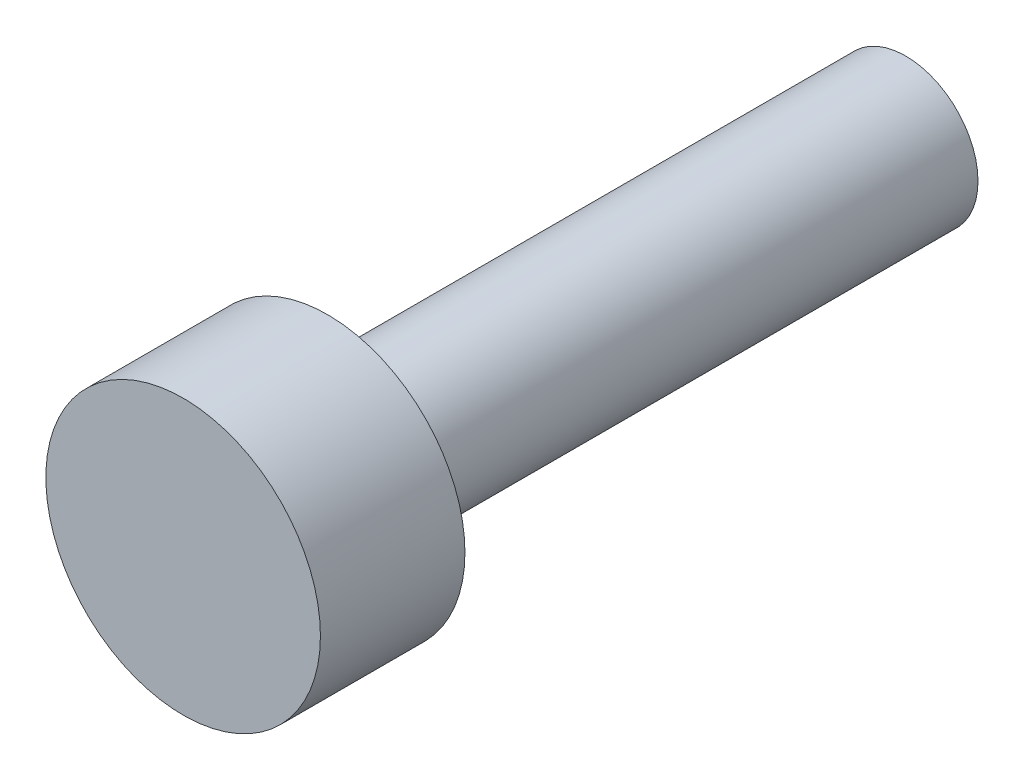
ISO-10303-21;
HEADER;
FILE_DESCRIPTION(('STEP AP214'),'2;1');
FILE_NAME('part.step','',(''),(''),'','','');
FILE_SCHEMA(('AUTOMOTIVE_DESIGN { 1 0 10303 214 1 1 1 1 }'));
ENDSEC;
DATA;
#1=APPLICATION_CONTEXT('core data for automotive mechanical design processes');
#2=APPLICATION_PROTOCOL_DEFINITION('international standard','automotive_design',2000,#1);
#3=PRODUCT_CONTEXT('',#1,'mechanical');
#4=PRODUCT('Part','Part','',(#3));
#5=PRODUCT_RELATED_PRODUCT_CATEGORY('part','',(#4));
#6=PRODUCT_DEFINITION_FORMATION('','',#4);
#7=PRODUCT_DEFINITION_CONTEXT('part definition',#1,'design');
#8=PRODUCT_DEFINITION('design','',#6,#7);
#9=PRODUCT_DEFINITION_SHAPE('','',#8);
#10=(LENGTH_UNIT() NAMED_UNIT(*) SI_UNIT(.MILLI.,.METRE.));
#11=(NAMED_UNIT(*) PLANE_ANGLE_UNIT() SI_UNIT($,.RADIAN.));
#12=(NAMED_UNIT(*) SI_UNIT($,.STERADIAN.) SOLID_ANGLE_UNIT());
#13=UNCERTAINTY_MEASURE_WITH_UNIT(LENGTH_MEASURE(1.E-05),#10,'distance_accuracy_value','');
#14=(GEOMETRIC_REPRESENTATION_CONTEXT(3) GLOBAL_UNCERTAINTY_ASSIGNED_CONTEXT((#13)) GLOBAL_UNIT_ASSIGNED_CONTEXT((#10,
#11,#12)) REPRESENTATION_CONTEXT('',''));
#15=CARTESIAN_POINT('',(0.,0.,0.));
#16=DIRECTION('',(0.,0.,1.));
#17=DIRECTION('',(1.,0.,0.));
#18=AXIS2_PLACEMENT_3D('',#15,#16,#17);
#19=CARTESIAN_POINT('',(0.,0.,0.));
#20=DIRECTION('',(0.,0.,-1.));
#21=DIRECTION('',(-1.,0.,0.));
#22=AXIS2_PLACEMENT_3D('',#19,#20,#21);
#23=CYLINDRICAL_SURFACE('',#22,1.);
#24=CARTESIAN_POINT('',(0.,0.,0.));
#25=DIRECTION('',(0.,0.,1.));
#26=DIRECTION('',(1.,0.,0.));
#27=AXIS2_PLACEMENT_3D('',#24,#25,#26);
#28=CIRCLE('',#27,1.);
#29=CARTESIAN_POINT('',(1.,0.,0.));
#30=VERTEX_POINT('',#29);
#31=EDGE_CURVE('E10',#30,#30,#28,.T.);
#32=ORIENTED_EDGE('',*,*,#31,.F.);
#33=EDGE_LOOP('',(#32));
#34=FACE_BOUND('',#33,.T.);
#35=CARTESIAN_POINT('',(0.,0.,-8.));
#36=DIRECTION('',(0.,0.,1.));
#37=DIRECTION('',(1.,0.,0.));
#38=AXIS2_PLACEMENT_3D('',#35,#36,#37);
#39=CIRCLE('',#38,1.);
#40=CARTESIAN_POINT('',(1.,0.,-8.));
#41=VERTEX_POINT('',#40);
#42=EDGE_CURVE('E37',#41,#41,#39,.T.);
#43=ORIENTED_EDGE('',*,*,#42,.T.);
#44=EDGE_LOOP('',(#43));
#45=FACE_BOUND('',#44,.T.);
#46=ADVANCED_FACE('F40',(#34,#45),#23,.T.);
#47=CARTESIAN_POINT('',(0.,0.,-8.));
#48=DIRECTION('',(0.,0.,1.));
#49=DIRECTION('',(1.,0.,0.));
#50=AXIS2_PLACEMENT_3D('',#47,#48,#49);
#51=PLANE('',#50);
#52=ORIENTED_EDGE('',*,*,#42,.F.);
#53=EDGE_LOOP('',(#52));
#54=FACE_BOUND('',#53,.T.);
#55=ADVANCED_FACE('F58',(#54),#51,.F.);
#56=CARTESIAN_POINT('',(0.,0.,2.));
#57=DIRECTION('',(0.,0.,-1.));
#58=DIRECTION('',(-1.,0.,0.));
#59=AXIS2_PLACEMENT_3D('',#56,#57,#58);
#60=CYLINDRICAL_SURFACE('',#59,1.9);
#61=CARTESIAN_POINT('',(0.,0.,2.));
#62=DIRECTION('',(0.,0.,1.));
#63=DIRECTION('',(1.,0.,0.));
#64=AXIS2_PLACEMENT_3D('',#61,#62,#63);
#65=CIRCLE('',#64,1.9);
#66=CARTESIAN_POINT('',(1.9,0.,2.));
#67=VERTEX_POINT('',#66);
#68=EDGE_CURVE('E50',#67,#67,#65,.T.);
#69=ORIENTED_EDGE('',*,*,#68,.F.);
#70=EDGE_LOOP('',(#69));
#71=FACE_BOUND('',#70,.T.);
#72=CARTESIAN_POINT('',(0.,0.,0.));
#73=DIRECTION('',(0.,0.,1.));
#74=DIRECTION('',(1.,0.,0.));
#75=AXIS2_PLACEMENT_3D('',#72,#73,#74);
#76=CIRCLE('',#75,1.9);
#77=CARTESIAN_POINT('',(1.9,0.,0.));
#78=VERTEX_POINT('',#77);
#79=EDGE_CURVE('E47',#78,#78,#76,.T.);
#80=ORIENTED_EDGE('',*,*,#79,.T.);
#81=EDGE_LOOP('',(#80));
#82=FACE_BOUND('',#81,.T.);
#83=ADVANCED_FACE('F60',(#71,#82),#60,.T.);
#84=CARTESIAN_POINT('',(0.,0.,2.));
#85=DIRECTION('',(0.,0.,1.));
#86=DIRECTION('',(1.,0.,0.));
#87=AXIS2_PLACEMENT_3D('',#84,#85,#86);
#88=PLANE('',#87);
#89=ORIENTED_EDGE('',*,*,#68,.T.);
#90=EDGE_LOOP('',(#89));
#91=FACE_BOUND('',#90,.T.);
#92=ADVANCED_FACE('F54',(#91),#88,.T.);
#93=CARTESIAN_POINT('',(0.,0.,0.));
#94=DIRECTION('',(0.,0.,1.));
#95=DIRECTION('',(1.,0.,0.));
#96=AXIS2_PLACEMENT_3D('',#93,#94,#95);
#97=PLANE('',#96);
#98=ORIENTED_EDGE('',*,*,#31,.T.);
#99=EDGE_LOOP('',(#98));
#100=FACE_BOUND('',#99,.T.);
#101=ORIENTED_EDGE('',*,*,#79,.F.);
#102=EDGE_LOOP('',(#101));
#103=FACE_BOUND('',#102,.T.);
#104=ADVANCED_FACE('F63',(#100,#103),#97,.F.);
#105=CLOSED_SHELL('',(#46,#55,#83,#92,#104));
#106=MANIFOLD_SOLID_BREP('B2',#105);
#107=ADVANCED_BREP_SHAPE_REPRESENTATION('',(#18,#106),#14);
#108=SHAPE_DEFINITION_REPRESENTATION(#9,#107);
ENDSEC;
END-ISO-10303-21;
